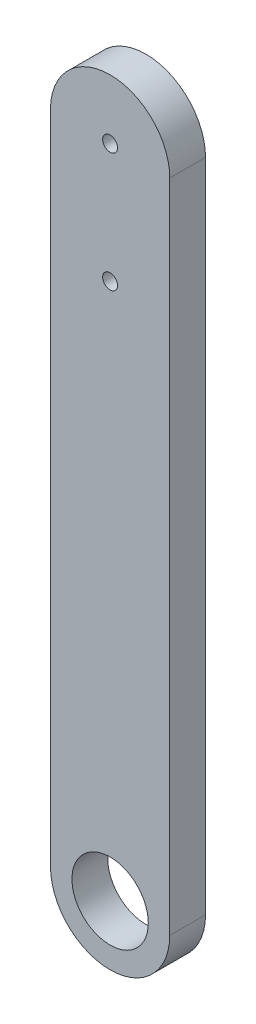
ISO-10303-21;
HEADER;
FILE_DESCRIPTION(('STEP AP214'),'2;1');
FILE_NAME('part.step','',(''),(''),'','','');
FILE_SCHEMA(('AUTOMOTIVE_DESIGN { 1 0 10303 214 1 1 1 1 }'));
ENDSEC;
DATA;
#1=APPLICATION_CONTEXT('core data for automotive mechanical design processes');
#2=APPLICATION_PROTOCOL_DEFINITION('international standard','automotive_design',2000,#1);
#3=PRODUCT_CONTEXT('',#1,'mechanical');
#4=PRODUCT('Part','Part','',(#3));
#5=PRODUCT_RELATED_PRODUCT_CATEGORY('part','',(#4));
#6=PRODUCT_DEFINITION_FORMATION('','',#4);
#7=PRODUCT_DEFINITION_CONTEXT('part definition',#1,'design');
#8=PRODUCT_DEFINITION('design','',#6,#7);
#9=PRODUCT_DEFINITION_SHAPE('','',#8);
#10=(LENGTH_UNIT() NAMED_UNIT(*) SI_UNIT(.MILLI.,.METRE.));
#11=(NAMED_UNIT(*) PLANE_ANGLE_UNIT() SI_UNIT($,.RADIAN.));
#12=(NAMED_UNIT(*) SI_UNIT($,.STERADIAN.) SOLID_ANGLE_UNIT());
#13=UNCERTAINTY_MEASURE_WITH_UNIT(LENGTH_MEASURE(1.E-05),#10,'distance_accuracy_value','');
#14=(GEOMETRIC_REPRESENTATION_CONTEXT(3) GLOBAL_UNCERTAINTY_ASSIGNED_CONTEXT((#13)) GLOBAL_UNIT_ASSIGNED_CONTEXT((#10,
#11,#12)) REPRESENTATION_CONTEXT('',''));
#15=CARTESIAN_POINT('',(0.,0.,0.));
#16=DIRECTION('',(0.,0.,1.));
#17=DIRECTION('',(1.,0.,0.));
#18=AXIS2_PLACEMENT_3D('',#15,#16,#17);
#19=CARTESIAN_POINT('',(-69.1410726802654,-13.6999999999981,6.));
#20=DIRECTION('',(0.,0.,1.));
#21=DIRECTION('',(1.,0.,0.));
#22=AXIS2_PLACEMENT_3D('',#19,#20,#21);
#23=PLANE('',#22);
#24=CARTESIAN_POINT('',(-69.1410726802654,-13.6999999999981,6.));
#25=DIRECTION('',(0.,0.,1.));
#26=DIRECTION('',(1.,0.,0.));
#27=AXIS2_PLACEMENT_3D('',#24,#25,#26);
#28=CIRCLE('',#27,1.24999999999997);
#29=CARTESIAN_POINT('',(-67.8910726802655,-13.6999999999981,6.));
#30=VERTEX_POINT('',#29);
#31=EDGE_CURVE('E138',#30,#30,#28,.T.);
#32=ORIENTED_EDGE('',*,*,#31,.F.);
#33=EDGE_LOOP('',(#32));
#34=FACE_BOUND('',#33,.T.);
#35=CARTESIAN_POINT('',(-69.1410726802654,-13.6999999999981,6.));
#36=DIRECTION('',(0.,0.,1.));
#37=DIRECTION('',(1.,0.,0.));
#38=AXIS2_PLACEMENT_3D('',#35,#36,#37);
#39=CIRCLE('',#38,10.);
#40=CARTESIAN_POINT('',(-59.1410726802654,-13.6999999999981,6.));
#41=VERTEX_POINT('',#40);
#42=CARTESIAN_POINT('',(-79.1410726802655,-13.6999999999981,6.));
#43=VERTEX_POINT('',#42);
#44=EDGE_CURVE('E96',#41,#43,#39,.T.);
#45=ORIENTED_EDGE('',*,*,#44,.T.);
#46=DIRECTION('',(0.,-1.,0.));
#47=VECTOR('',#46,1.);
#48=CARTESIAN_POINT('',(-79.1410726802655,-13.6999999999981,6.));
#49=LINE('',#48,#47);
#50=CARTESIAN_POINT('',(-79.1410726802654,-123.699999999998,6.));
#51=VERTEX_POINT('',#50);
#52=EDGE_CURVE('E91',#43,#51,#49,.T.);
#53=ORIENTED_EDGE('',*,*,#52,.T.);
#54=CARTESIAN_POINT('',(-69.1410726802654,-123.699999999998,6.));
#55=DIRECTION('',(0.,0.,1.));
#56=DIRECTION('',(1.,0.,0.));
#57=AXIS2_PLACEMENT_3D('',#54,#55,#56);
#58=CIRCLE('',#57,10.);
#59=CARTESIAN_POINT('',(-59.1410726802654,-123.699999999998,6.));
#60=VERTEX_POINT('',#59);
#61=EDGE_CURVE('E94',#51,#60,#58,.T.);
#62=ORIENTED_EDGE('',*,*,#61,.T.);
#63=DIRECTION('',(0.,1.,0.));
#64=VECTOR('',#63,1.);
#65=CARTESIAN_POINT('',(-59.1410726802654,-123.699999999998,6.));
#66=LINE('',#65,#64);
#67=EDGE_CURVE('E61',#60,#41,#66,.T.);
#68=ORIENTED_EDGE('',*,*,#67,.T.);
#69=EDGE_LOOP('',(#45,#53,#62,#68));
#70=FACE_BOUND('',#69,.T.);
#71=CARTESIAN_POINT('',(-69.1410726802654,-33.6999999999981,6.));
#72=DIRECTION('',(0.,0.,1.));
#73=DIRECTION('',(1.,0.,0.));
#74=AXIS2_PLACEMENT_3D('',#71,#72,#73);
#75=CIRCLE('',#74,1.24999999999999);
#76=CARTESIAN_POINT('',(-67.8910726802654,-33.6999999999981,6.));
#77=VERTEX_POINT('',#76);
#78=EDGE_CURVE('E116',#77,#77,#75,.T.);
#79=ORIENTED_EDGE('',*,*,#78,.F.);
#80=EDGE_LOOP('',(#79));
#81=FACE_BOUND('',#80,.T.);
#82=CARTESIAN_POINT('',(-69.1410726802654,-123.699999999998,6.));
#83=DIRECTION('',(0.,0.,1.));
#84=DIRECTION('',(1.,0.,0.));
#85=AXIS2_PLACEMENT_3D('',#82,#83,#84);
#86=CIRCLE('',#85,6.40000000000001);
#87=CARTESIAN_POINT('',(-62.7410726802654,-123.699999999998,6.));
#88=VERTEX_POINT('',#87);
#89=EDGE_CURVE('E146',#88,#88,#86,.T.);
#90=ORIENTED_EDGE('',*,*,#89,.F.);
#91=EDGE_LOOP('',(#90));
#92=FACE_BOUND('',#91,.T.);
#93=ADVANCED_FACE('F43',(#34,#70,#81,#92),#23,.T.);
#94=CARTESIAN_POINT('',(-69.1410726802654,-13.6999999999981,0.));
#95=DIRECTION('',(0.,0.,1.));
#96=DIRECTION('',(1.,0.,0.));
#97=AXIS2_PLACEMENT_3D('',#94,#95,#96);
#98=PLANE('',#97);
#99=CARTESIAN_POINT('',(-69.1410726802654,-13.6999999999981,0.));
#100=DIRECTION('',(0.,0.,1.));
#101=DIRECTION('',(1.,0.,0.));
#102=AXIS2_PLACEMENT_3D('',#99,#100,#101);
#103=CIRCLE('',#102,10.);
#104=CARTESIAN_POINT('',(-59.1410726802654,-13.6999999999981,0.));
#105=VERTEX_POINT('',#104);
#106=CARTESIAN_POINT('',(-79.1410726802655,-13.6999999999981,0.));
#107=VERTEX_POINT('',#106);
#108=EDGE_CURVE('E112',#105,#107,#103,.T.);
#109=ORIENTED_EDGE('',*,*,#108,.F.);
#110=DIRECTION('',(0.,1.,0.));
#111=VECTOR('',#110,1.);
#112=CARTESIAN_POINT('',(-59.1410726802654,-123.699999999998,0.));
#113=LINE('',#112,#111);
#114=CARTESIAN_POINT('',(-59.1410726802654,-123.699999999998,0.));
#115=VERTEX_POINT('',#114);
#116=EDGE_CURVE('E84',#115,#105,#113,.T.);
#117=ORIENTED_EDGE('',*,*,#116,.F.);
#118=CARTESIAN_POINT('',(-69.1410726802654,-123.699999999998,0.));
#119=DIRECTION('',(0.,0.,1.));
#120=DIRECTION('',(1.,0.,0.));
#121=AXIS2_PLACEMENT_3D('',#118,#119,#120);
#122=CIRCLE('',#121,10.);
#123=CARTESIAN_POINT('',(-79.1410726802654,-123.699999999998,0.));
#124=VERTEX_POINT('',#123);
#125=EDGE_CURVE('E78',#124,#115,#122,.T.);
#126=ORIENTED_EDGE('',*,*,#125,.F.);
#127=DIRECTION('',(0.,-1.,0.));
#128=VECTOR('',#127,1.);
#129=CARTESIAN_POINT('',(-79.1410726802655,-13.6999999999981,0.));
#130=LINE('',#129,#128);
#131=EDGE_CURVE('E101',#107,#124,#130,.T.);
#132=ORIENTED_EDGE('',*,*,#131,.F.);
#133=EDGE_LOOP('',(#109,#117,#126,#132));
#134=FACE_BOUND('',#133,.T.);
#135=CARTESIAN_POINT('',(-69.1410726802654,-33.6999999999981,0.));
#136=DIRECTION('',(0.,0.,1.));
#137=DIRECTION('',(1.,0.,0.));
#138=AXIS2_PLACEMENT_3D('',#135,#136,#137);
#139=CIRCLE('',#138,1.24999999999999);
#140=CARTESIAN_POINT('',(-67.8910726802654,-33.6999999999981,0.));
#141=VERTEX_POINT('',#140);
#142=EDGE_CURVE('E134',#141,#141,#139,.T.);
#143=ORIENTED_EDGE('',*,*,#142,.T.);
#144=EDGE_LOOP('',(#143));
#145=FACE_BOUND('',#144,.T.);
#146=CARTESIAN_POINT('',(-69.1410726802654,-13.6999999999981,0.));
#147=DIRECTION('',(0.,0.,1.));
#148=DIRECTION('',(1.,0.,0.));
#149=AXIS2_PLACEMENT_3D('',#146,#147,#148);
#150=CIRCLE('',#149,1.24999999999997);
#151=CARTESIAN_POINT('',(-67.8910726802655,-13.6999999999981,0.));
#152=VERTEX_POINT('',#151);
#153=EDGE_CURVE('E142',#152,#152,#150,.T.);
#154=ORIENTED_EDGE('',*,*,#153,.T.);
#155=EDGE_LOOP('',(#154));
#156=FACE_BOUND('',#155,.T.);
#157=CARTESIAN_POINT('',(-69.1410726802654,-123.699999999998,0.));
#158=DIRECTION('',(0.,0.,1.));
#159=DIRECTION('',(1.,0.,0.));
#160=AXIS2_PLACEMENT_3D('',#157,#158,#159);
#161=CIRCLE('',#160,6.40000000000001);
#162=CARTESIAN_POINT('',(-62.7410726802654,-123.699999999998,0.));
#163=VERTEX_POINT('',#162);
#164=EDGE_CURVE('E150',#163,#163,#161,.T.);
#165=ORIENTED_EDGE('',*,*,#164,.T.);
#166=EDGE_LOOP('',(#165));
#167=FACE_BOUND('',#166,.T.);
#168=ADVANCED_FACE('F129',(#134,#145,#156,#167),#98,.F.);
#169=CARTESIAN_POINT('',(-69.1410726802654,-13.6999999999981,6.));
#170=DIRECTION('',(0.,0.,-1.));
#171=DIRECTION('',(-1.,0.,0.));
#172=AXIS2_PLACEMENT_3D('',#169,#170,#171);
#173=CYLINDRICAL_SURFACE('',#172,10.);
#174=ORIENTED_EDGE('',*,*,#108,.T.);
#175=DIRECTION('',(0.,0.,-1.));
#176=VECTOR('',#175,1.);
#177=CARTESIAN_POINT('',(-79.1410726802655,-13.6999999999981,6.));
#178=LINE('',#177,#176);
#179=EDGE_CURVE('E11',#43,#107,#178,.T.);
#180=ORIENTED_EDGE('',*,*,#179,.F.);
#181=ORIENTED_EDGE('',*,*,#44,.F.);
#182=DIRECTION('',(0.,0.,-1.));
#183=VECTOR('',#182,1.);
#184=CARTESIAN_POINT('',(-59.1410726802654,-13.6999999999981,6.));
#185=LINE('',#184,#183);
#186=EDGE_CURVE('E108',#41,#105,#185,.T.);
#187=ORIENTED_EDGE('',*,*,#186,.T.);
#188=EDGE_LOOP('',(#174,#180,#181,#187));
#189=FACE_BOUND('',#188,.T.);
#190=ADVANCED_FACE('F45',(#189),#173,.T.);
#191=CARTESIAN_POINT('',(-79.1410726802655,-13.6999999999981,6.));
#192=DIRECTION('',(1.,0.,0.));
#193=DIRECTION('',(0.,1.,0.));
#194=AXIS2_PLACEMENT_3D('',#191,#192,#193);
#195=PLANE('',#194);
#196=ORIENTED_EDGE('',*,*,#131,.T.);
#197=DIRECTION('',(0.,0.,-1.));
#198=VECTOR('',#197,1.);
#199=CARTESIAN_POINT('',(-79.1410726802654,-123.699999999998,6.));
#200=LINE('',#199,#198);
#201=EDGE_CURVE('E53',#51,#124,#200,.T.);
#202=ORIENTED_EDGE('',*,*,#201,.F.);
#203=ORIENTED_EDGE('',*,*,#52,.F.);
#204=ORIENTED_EDGE('',*,*,#179,.T.);
#205=EDGE_LOOP('',(#196,#202,#203,#204));
#206=FACE_BOUND('',#205,.T.);
#207=ADVANCED_FACE('F100',(#206),#195,.F.);
#208=CARTESIAN_POINT('',(-69.1410726802654,-123.699999999998,6.));
#209=DIRECTION('',(0.,0.,-1.));
#210=DIRECTION('',(-1.,0.,0.));
#211=AXIS2_PLACEMENT_3D('',#208,#209,#210);
#212=CYLINDRICAL_SURFACE('',#211,10.);
#213=ORIENTED_EDGE('',*,*,#125,.T.);
#214=DIRECTION('',(0.,0.,-1.));
#215=VECTOR('',#214,1.);
#216=CARTESIAN_POINT('',(-59.1410726802654,-123.699999999998,6.));
#217=LINE('',#216,#215);
#218=EDGE_CURVE('E103',#60,#115,#217,.T.);
#219=ORIENTED_EDGE('',*,*,#218,.F.);
#220=ORIENTED_EDGE('',*,*,#61,.F.);
#221=ORIENTED_EDGE('',*,*,#201,.T.);
#222=EDGE_LOOP('',(#213,#219,#220,#221));
#223=FACE_BOUND('',#222,.T.);
#224=ADVANCED_FACE('F104',(#223),#212,.T.);
#225=CARTESIAN_POINT('',(-59.1410726802654,-123.699999999998,6.));
#226=DIRECTION('',(-1.,0.,0.));
#227=DIRECTION('',(0.,-1.,0.));
#228=AXIS2_PLACEMENT_3D('',#225,#226,#227);
#229=PLANE('',#228);
#230=ORIENTED_EDGE('',*,*,#116,.T.);
#231=ORIENTED_EDGE('',*,*,#186,.F.);
#232=ORIENTED_EDGE('',*,*,#67,.F.);
#233=ORIENTED_EDGE('',*,*,#218,.T.);
#234=EDGE_LOOP('',(#230,#231,#232,#233));
#235=FACE_BOUND('',#234,.T.);
#236=ADVANCED_FACE('F126',(#235),#229,.F.);
#237=CARTESIAN_POINT('',(-69.1410726802654,-33.6999999999981,6.));
#238=DIRECTION('',(0.,0.,-1.));
#239=DIRECTION('',(-1.,0.,0.));
#240=AXIS2_PLACEMENT_3D('',#237,#238,#239);
#241=CYLINDRICAL_SURFACE('',#240,1.24999999999999);
#242=ORIENTED_EDGE('',*,*,#78,.T.);
#243=EDGE_LOOP('',(#242));
#244=FACE_BOUND('',#243,.T.);
#245=ORIENTED_EDGE('',*,*,#142,.F.);
#246=EDGE_LOOP('',(#245));
#247=FACE_BOUND('',#246,.T.);
#248=ADVANCED_FACE('F170',(#244,#247),#241,.F.);
#249=CARTESIAN_POINT('',(-69.1410726802654,-13.6999999999981,6.));
#250=DIRECTION('',(0.,0.,-1.));
#251=DIRECTION('',(-1.,0.,0.));
#252=AXIS2_PLACEMENT_3D('',#249,#250,#251);
#253=CYLINDRICAL_SURFACE('',#252,1.24999999999997);
#254=ORIENTED_EDGE('',*,*,#31,.T.);
#255=EDGE_LOOP('',(#254));
#256=FACE_BOUND('',#255,.T.);
#257=ORIENTED_EDGE('',*,*,#153,.F.);
#258=EDGE_LOOP('',(#257));
#259=FACE_BOUND('',#258,.T.);
#260=ADVANCED_FACE('F224',(#256,#259),#253,.F.);
#261=CARTESIAN_POINT('',(-69.1410726802654,-123.699999999998,6.));
#262=DIRECTION('',(0.,0.,-1.));
#263=DIRECTION('',(-1.,0.,0.));
#264=AXIS2_PLACEMENT_3D('',#261,#262,#263);
#265=CYLINDRICAL_SURFACE('',#264,6.40000000000001);
#266=ORIENTED_EDGE('',*,*,#89,.T.);
#267=EDGE_LOOP('',(#266));
#268=FACE_BOUND('',#267,.T.);
#269=ORIENTED_EDGE('',*,*,#164,.F.);
#270=EDGE_LOOP('',(#269));
#271=FACE_BOUND('',#270,.T.);
#272=ADVANCED_FACE('F158',(#268,#271),#265,.F.);
#273=CLOSED_SHELL('',(#93,#168,#190,#207,#224,#236,#248,#260,#272));
#274=MANIFOLD_SOLID_BREP('B2',#273);
#275=ADVANCED_BREP_SHAPE_REPRESENTATION('',(#18,#274),#14);
#276=SHAPE_DEFINITION_REPRESENTATION(#9,#275);
ENDSEC;
END-ISO-10303-21;
